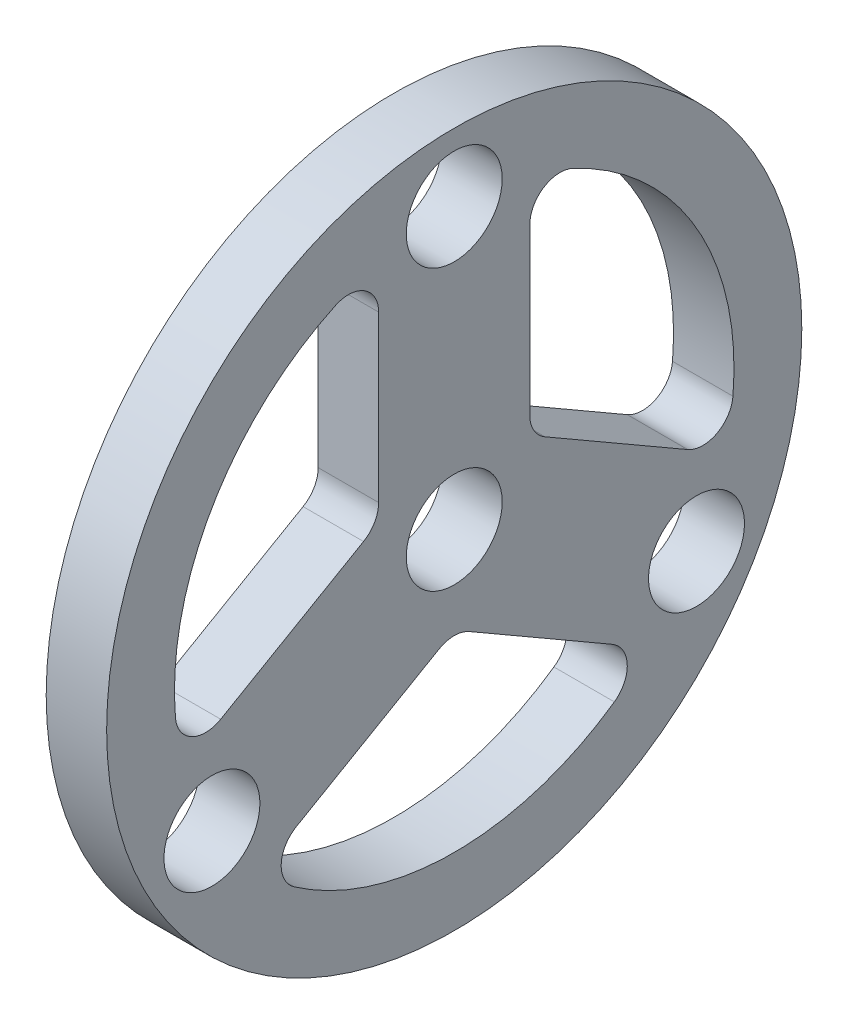
ISO-10303-21;
HEADER;
FILE_DESCRIPTION(('STEP AP214'),'2;1');
FILE_NAME('part.step','',(''),(''),'','','');
FILE_SCHEMA(('AUTOMOTIVE_DESIGN { 1 0 10303 214 1 1 1 1 }'));
ENDSEC;
DATA;
#1=APPLICATION_CONTEXT('core data for automotive mechanical design processes');
#2=APPLICATION_PROTOCOL_DEFINITION('international standard','automotive_design',2000,#1);
#3=PRODUCT_CONTEXT('',#1,'mechanical');
#4=PRODUCT('Part','Part','',(#3));
#5=PRODUCT_RELATED_PRODUCT_CATEGORY('part','',(#4));
#6=PRODUCT_DEFINITION_FORMATION('','',#4);
#7=PRODUCT_DEFINITION_CONTEXT('part definition',#1,'design');
#8=PRODUCT_DEFINITION('design','',#6,#7);
#9=PRODUCT_DEFINITION_SHAPE('','',#8);
#10=(LENGTH_UNIT() NAMED_UNIT(*) SI_UNIT(.MILLI.,.METRE.));
#11=(NAMED_UNIT(*) PLANE_ANGLE_UNIT() SI_UNIT($,.RADIAN.));
#12=(NAMED_UNIT(*) SI_UNIT($,.STERADIAN.) SOLID_ANGLE_UNIT());
#13=UNCERTAINTY_MEASURE_WITH_UNIT(LENGTH_MEASURE(1.E-05),#10,'distance_accuracy_value','');
#14=(GEOMETRIC_REPRESENTATION_CONTEXT(3) GLOBAL_UNCERTAINTY_ASSIGNED_CONTEXT((#13)) GLOBAL_UNIT_ASSIGNED_CONTEXT((#10,
#11,#12)) REPRESENTATION_CONTEXT('',''));
#15=CARTESIAN_POINT('',(0.,0.,0.));
#16=DIRECTION('',(0.,0.,1.));
#17=DIRECTION('',(1.,0.,0.));
#18=AXIS2_PLACEMENT_3D('',#15,#16,#17);
#19=CARTESIAN_POINT('',(4.,0.,0.));
#20=DIRECTION('',(1.,0.,0.));
#21=DIRECTION('',(0.,0.,-1.));
#22=AXIS2_PLACEMENT_3D('',#19,#20,#21);
#23=PLANE('',#22);
#24=DIRECTION('',(0.,1.,0.));
#25=VECTOR('',#24,1.);
#26=CARTESIAN_POINT('',(4.,4.04145188432742,5.00000000000001));
#27=LINE('',#26,#25);
#28=CARTESIAN_POINT('',(4.,4.04145188432742,5.00000000000001));
#29=VERTEX_POINT('',#28);
#30=CARTESIAN_POINT('',(4.,14.9553554371001,5.00000000000001));
#31=VERTEX_POINT('',#30);
#32=EDGE_CURVE('E211',#29,#31,#27,.T.);
#33=ORIENTED_EDGE('',*,*,#32,.F.);
#34=CARTESIAN_POINT('',(4.,4.04145188432741,7.00000000000001));
#35=DIRECTION('',(1.,0.,0.));
#36=DIRECTION('',(0.,0.,-1.));
#37=AXIS2_PLACEMENT_3D('',#34,#35,#36);
#38=CIRCLE('',#37,2.);
#39=CARTESIAN_POINT('',(4.,2.30940107675852,6.00000000000003));
#40=VERTEX_POINT('',#39);
#41=EDGE_CURVE('E209',#40,#29,#38,.T.);
#42=ORIENTED_EDGE('',*,*,#41,.F.);
#43=DIRECTION('',(0.,0.499999999999992,-0.866025403784443));
#44=VECTOR('',#43,1.);
#45=CARTESIAN_POINT('',(4.,2.30940107675852,6.00000000000003));
#46=LINE('',#45,#44);
#47=CARTESIAN_POINT('',(4.,-3.14755069962773,15.4517177311545));
#48=VERTEX_POINT('',#47);
#49=EDGE_CURVE('E221',#48,#40,#46,.T.);
#50=ORIENTED_EDGE('',*,*,#49,.F.);
#51=CARTESIAN_POINT('',(4.,-1.41549989205884,16.4517177311544));
#52=DIRECTION('',(1.,0.,0.));
#53=DIRECTION('',(0.,0.,1.));
#54=AXIS2_PLACEMENT_3D('',#51,#52,#53);
#55=CIRCLE('',#54,2.);
#56=CARTESIAN_POINT('',(4.,-1.58694575332259,18.4443557606659));
#57=VERTEX_POINT('',#56);
#58=EDGE_CURVE('E218',#57,#48,#55,.T.);
#59=ORIENTED_EDGE('',*,*,#58,.F.);
#60=CARTESIAN_POINT('',(4.,0.,0.));
#61=DIRECTION('',(1.,0.,0.));
#62=DIRECTION('',(0.,0.,-1.));
#63=AXIS2_PLACEMENT_3D('',#60,#61,#62);
#64=CIRCLE('',#63,18.5125);
#65=CARTESIAN_POINT('',(4.,16.7667535218359,7.84784254352764));
#66=VERTEX_POINT('',#65);
#67=EDGE_CURVE('E216',#66,#57,#64,.T.);
#68=ORIENTED_EDGE('',*,*,#67,.F.);
#69=CARTESIAN_POINT('',(4.,14.9553554371001,7.00000000000001));
#70=DIRECTION('',(1.,0.,0.));
#71=DIRECTION('',(0.,0.,-1.));
#72=AXIS2_PLACEMENT_3D('',#69,#70,#71);
#73=CIRCLE('',#72,2.);
#74=EDGE_CURVE('E214',#31,#66,#73,.T.);
#75=ORIENTED_EDGE('',*,*,#74,.F.);
#76=EDGE_LOOP('',(#33,#42,#50,#59,#68,#75));
#77=FACE_BOUND('',#76,.T.);
#78=CARTESIAN_POINT('',(4.,-9.25624999999985,16.0322952875595));
#79=DIRECTION('',(1.,0.,0.));
#80=DIRECTION('',(0.,0.,-1.));
#81=AXIS2_PLACEMENT_3D('',#78,#79,#80);
#82=CIRCLE('',#81,3.175);
#83=CARTESIAN_POINT('',(4.,-9.25624999999985,12.8572952875595));
#84=VERTEX_POINT('',#83);
#85=EDGE_CURVE('E299',#84,#84,#82,.T.);
#86=ORIENTED_EDGE('',*,*,#85,.F.);
#87=EDGE_LOOP('',(#86));
#88=FACE_BOUND('',#87,.T.);
#89=CARTESIAN_POINT('',(4.,18.5125,0.));
#90=DIRECTION('',(1.,0.,0.));
#91=DIRECTION('',(0.,0.,-1.));
#92=AXIS2_PLACEMENT_3D('',#89,#90,#91);
#93=CIRCLE('',#92,3.175);
#94=CARTESIAN_POINT('',(4.,18.5125,-3.175));
#95=VERTEX_POINT('',#94);
#96=EDGE_CURVE('E311',#95,#95,#93,.T.);
#97=ORIENTED_EDGE('',*,*,#96,.F.);
#98=EDGE_LOOP('',(#97));
#99=FACE_BOUND('',#98,.T.);
#100=CARTESIAN_POINT('',(4.,0.,0.));
#101=DIRECTION('',(1.,0.,0.));
#102=DIRECTION('',(0.,0.,-1.));
#103=AXIS2_PLACEMENT_3D('',#100,#101,#102);
#104=CIRCLE('',#103,23.);
#105=CARTESIAN_POINT('',(4.,0.,-23.));
#106=VERTEX_POINT('',#105);
#107=EDGE_CURVE('E11',#106,#106,#104,.T.);
#108=ORIENTED_EDGE('',*,*,#107,.T.);
#109=EDGE_LOOP('',(#108));
#110=FACE_BOUND('',#109,.T.);
#111=CARTESIAN_POINT('',(4.,0.,0.));
#112=DIRECTION('',(1.,0.,0.));
#113=DIRECTION('',(0.,0.,-1.));
#114=AXIS2_PLACEMENT_3D('',#111,#112,#113);
#115=CIRCLE('',#114,3.175);
#116=CARTESIAN_POINT('',(4.,0.,-3.17499999999999));
#117=VERTEX_POINT('',#116);
#118=EDGE_CURVE('E317',#117,#117,#115,.T.);
#119=ORIENTED_EDGE('',*,*,#118,.F.);
#120=EDGE_LOOP('',(#119));
#121=FACE_BOUND('',#120,.T.);
#122=CARTESIAN_POINT('',(4.,-9.25625000000008,-16.0322952875594));
#123=DIRECTION('',(1.,0.,0.));
#124=DIRECTION('',(0.,0.,-1.));
#125=AXIS2_PLACEMENT_3D('',#122,#123,#124);
#126=CIRCLE('',#125,3.175);
#127=CARTESIAN_POINT('',(4.,-9.25625000000008,-19.2072952875594));
#128=VERTEX_POINT('',#127);
#129=EDGE_CURVE('E305',#128,#128,#126,.T.);
#130=ORIENTED_EDGE('',*,*,#129,.F.);
#131=EDGE_LOOP('',(#130));
#132=FACE_BOUND('',#131,.T.);
#133=DIRECTION('',(0.,-0.500000000000004,-0.866025403784436));
#134=VECTOR('',#133,1.);
#135=CARTESIAN_POINT('',(4.,2.30940107675846,-6.00000000000005));
#136=LINE('',#135,#134);
#137=CARTESIAN_POINT('',(4.,2.30940107675846,-6.00000000000005));
#138=VERTEX_POINT('',#137);
#139=CARTESIAN_POINT('',(4.,-3.14755069962793,-15.4517177311544));
#140=VERTEX_POINT('',#139);
#141=EDGE_CURVE('E256',#138,#140,#136,.T.);
#142=ORIENTED_EDGE('',*,*,#141,.F.);
#143=CARTESIAN_POINT('',(4.,4.04145188432734,-7.00000000000005));
#144=DIRECTION('',(1.,0.,0.));
#145=DIRECTION('',(0.,0.,-1.));
#146=AXIS2_PLACEMENT_3D('',#143,#144,#145);
#147=CIRCLE('',#146,2.);
#148=CARTESIAN_POINT('',(4.,4.04145188432738,-5.00000000000005));
#149=VERTEX_POINT('',#148);
#150=EDGE_CURVE('E254',#149,#138,#147,.T.);
#151=ORIENTED_EDGE('',*,*,#150,.F.);
#152=DIRECTION('',(0.,-1.,0.));
#153=VECTOR('',#152,1.);
#154=CARTESIAN_POINT('',(4.,4.04145188432738,-5.00000000000005));
#155=LINE('',#154,#153);
#156=CARTESIAN_POINT('',(4.,14.9553554371,-5.0000000000002));
#157=VERTEX_POINT('',#156);
#158=EDGE_CURVE('E266',#157,#149,#155,.T.);
#159=ORIENTED_EDGE('',*,*,#158,.F.);
#160=CARTESIAN_POINT('',(4.,14.9553554371,-7.0000000000002));
#161=DIRECTION('',(1.,0.,0.));
#162=DIRECTION('',(0.,0.,1.));
#163=AXIS2_PLACEMENT_3D('',#160,#161,#162);
#164=CIRCLE('',#163,2.);
#165=CARTESIAN_POINT('',(4.,16.7667535218358,-7.84784254352786));
#166=VERTEX_POINT('',#165);
#167=EDGE_CURVE('E263',#166,#157,#164,.T.);
#168=ORIENTED_EDGE('',*,*,#167,.F.);
#169=CARTESIAN_POINT('',(4.,0.,0.));
#170=DIRECTION('',(1.,0.,0.));
#171=DIRECTION('',(0.,0.,-1.));
#172=AXIS2_PLACEMENT_3D('',#169,#170,#171);
#173=CIRCLE('',#172,18.5125);
#174=CARTESIAN_POINT('',(4.,-1.58694575332283,-18.4443557606659));
#175=VERTEX_POINT('',#174);
#176=EDGE_CURVE('E261',#175,#166,#173,.T.);
#177=ORIENTED_EDGE('',*,*,#176,.F.);
#178=CARTESIAN_POINT('',(4.,-1.41549989205905,-16.4517177311544));
#179=DIRECTION('',(1.,0.,0.));
#180=DIRECTION('',(0.,0.,-1.));
#181=AXIS2_PLACEMENT_3D('',#178,#179,#180);
#182=CIRCLE('',#181,2.);
#183=EDGE_CURVE('E259',#140,#175,#182,.T.);
#184=ORIENTED_EDGE('',*,*,#183,.F.);
#185=EDGE_LOOP('',(#142,#151,#159,#168,#177,#184));
#186=FACE_BOUND('',#185,.T.);
#187=DIRECTION('',(0.,-0.499999999999992,0.866025403784443));
#188=VECTOR('',#187,1.);
#189=CARTESIAN_POINT('',(4.,-6.3508529610859,1.00000000000009));
#190=LINE('',#189,#188);
#191=CARTESIAN_POINT('',(4.,-6.3508529610859,1.00000000000009));
#192=VERTEX_POINT('',#191);
#193=CARTESIAN_POINT('',(4.,-11.8078047374722,10.4517177311545));
#194=VERTEX_POINT('',#193);
#195=EDGE_CURVE('E166',#192,#194,#190,.T.);
#196=ORIENTED_EDGE('',*,*,#195,.F.);
#197=CARTESIAN_POINT('',(4.,-8.08290376865478,1.00180280737661E-13));
#198=DIRECTION('',(1.,0.,0.));
#199=DIRECTION('',(0.,0.,-1.));
#200=AXIS2_PLACEMENT_3D('',#197,#198,#199);
#201=CIRCLE('',#200,2.);
#202=CARTESIAN_POINT('',(4.,-6.35085296108593,-0.99999999999994));
#203=VERTEX_POINT('',#202);
#204=EDGE_CURVE('E158',#203,#192,#201,.T.);
#205=ORIENTED_EDGE('',*,*,#204,.F.);
#206=DIRECTION('',(0.,0.499999999999975,0.866025403784453));
#207=VECTOR('',#206,1.);
#208=CARTESIAN_POINT('',(4.,-6.35085296108593,-0.99999999999994));
#209=LINE('',#208,#207);
#210=CARTESIAN_POINT('',(4.,-11.8078047374721,-10.4517177311546));
#211=VERTEX_POINT('',#210);
#212=EDGE_CURVE('E187',#211,#203,#209,.T.);
#213=ORIENTED_EDGE('',*,*,#212,.F.);
#214=CARTESIAN_POINT('',(4.,-13.539855545041,-9.45171773115464));
#215=DIRECTION('',(1.,0.,0.));
#216=DIRECTION('',(0.,0.,1.));
#217=AXIS2_PLACEMENT_3D('',#214,#215,#216);
#218=CIRCLE('',#217,2.);
#219=CARTESIAN_POINT('',(4.,-15.179807768513,-10.5965132171385));
#220=VERTEX_POINT('',#219);
#221=EDGE_CURVE('E185',#220,#211,#218,.T.);
#222=ORIENTED_EDGE('',*,*,#221,.F.);
#223=CARTESIAN_POINT('',(4.,0.,0.));
#224=DIRECTION('',(1.,0.,0.));
#225=DIRECTION('',(0.,0.,-1.));
#226=AXIS2_PLACEMENT_3D('',#223,#224,#225);
#227=CIRCLE('',#226,18.5125);
#228=CARTESIAN_POINT('',(4.,-15.1798077685131,10.5965132171384));
#229=VERTEX_POINT('',#228);
#230=EDGE_CURVE('E181',#229,#220,#227,.T.);
#231=ORIENTED_EDGE('',*,*,#230,.F.);
#232=CARTESIAN_POINT('',(4.,-13.539855545041,9.45171773115455));
#233=DIRECTION('',(1.,0.,0.));
#234=DIRECTION('',(0.,0.,-1.));
#235=AXIS2_PLACEMENT_3D('',#232,#233,#234);
#236=CIRCLE('',#235,2.);
#237=EDGE_CURVE('E179',#194,#229,#236,.T.);
#238=ORIENTED_EDGE('',*,*,#237,.F.);
#239=EDGE_LOOP('',(#196,#205,#213,#222,#231,#238));
#240=FACE_BOUND('',#239,.T.);
#241=ADVANCED_FACE('F33',(#77,#88,#99,#110,#121,#132,#186,#240),#23,.T.);
#242=CARTESIAN_POINT('',(0.,0.,0.));
#243=DIRECTION('',(1.,0.,0.));
#244=DIRECTION('',(0.,0.,-1.));
#245=AXIS2_PLACEMENT_3D('',#242,#243,#244);
#246=PLANE('',#245);
#247=CARTESIAN_POINT('',(0.,4.04145188432741,7.00000000000001));
#248=DIRECTION('',(1.,0.,0.));
#249=DIRECTION('',(0.,0.,-1.));
#250=AXIS2_PLACEMENT_3D('',#247,#248,#249);
#251=CIRCLE('',#250,2.);
#252=CARTESIAN_POINT('',(0.,2.30940107675852,6.00000000000003));
#253=VERTEX_POINT('',#252);
#254=CARTESIAN_POINT('',(0.,4.04145188432742,5.00000000000001));
#255=VERTEX_POINT('',#254);
#256=EDGE_CURVE('E174',#253,#255,#251,.T.);
#257=ORIENTED_EDGE('',*,*,#256,.T.);
#258=DIRECTION('',(0.,1.,0.));
#259=VECTOR('',#258,1.);
#260=CARTESIAN_POINT('',(0.,4.04145188432742,5.00000000000001));
#261=LINE('',#260,#259);
#262=CARTESIAN_POINT('',(0.,14.9553554371001,5.00000000000001));
#263=VERTEX_POINT('',#262);
#264=EDGE_CURVE('E226',#255,#263,#261,.T.);
#265=ORIENTED_EDGE('',*,*,#264,.T.);
#266=CARTESIAN_POINT('',(0.,14.9553554371001,7.00000000000001));
#267=DIRECTION('',(1.,0.,0.));
#268=DIRECTION('',(0.,0.,-1.));
#269=AXIS2_PLACEMENT_3D('',#266,#267,#268);
#270=CIRCLE('',#269,2.);
#271=CARTESIAN_POINT('',(0.,16.7667535218359,7.84784254352764));
#272=VERTEX_POINT('',#271);
#273=EDGE_CURVE('E229',#263,#272,#270,.T.);
#274=ORIENTED_EDGE('',*,*,#273,.T.);
#275=CARTESIAN_POINT('',(0.,0.,0.));
#276=DIRECTION('',(1.,0.,0.));
#277=DIRECTION('',(0.,0.,-1.));
#278=AXIS2_PLACEMENT_3D('',#275,#276,#277);
#279=CIRCLE('',#278,18.5125);
#280=CARTESIAN_POINT('',(0.,-1.58694575332259,18.4443557606659));
#281=VERTEX_POINT('',#280);
#282=EDGE_CURVE('E232',#272,#281,#279,.T.);
#283=ORIENTED_EDGE('',*,*,#282,.T.);
#284=CARTESIAN_POINT('',(0.,-1.41549989205884,16.4517177311544));
#285=DIRECTION('',(1.,0.,0.));
#286=DIRECTION('',(0.,0.,1.));
#287=AXIS2_PLACEMENT_3D('',#284,#285,#286);
#288=CIRCLE('',#287,2.);
#289=CARTESIAN_POINT('',(0.,-3.14755069962773,15.4517177311545));
#290=VERTEX_POINT('',#289);
#291=EDGE_CURVE('E235',#281,#290,#288,.T.);
#292=ORIENTED_EDGE('',*,*,#291,.T.);
#293=DIRECTION('',(0.,0.499999999999992,-0.866025403784443));
#294=VECTOR('',#293,1.);
#295=CARTESIAN_POINT('',(0.,2.30940107675852,6.00000000000003));
#296=LINE('',#295,#294);
#297=EDGE_CURVE('E212',#290,#253,#296,.T.);
#298=ORIENTED_EDGE('',*,*,#297,.T.);
#299=EDGE_LOOP('',(#257,#265,#274,#283,#292,#298));
#300=FACE_BOUND('',#299,.T.);
#301=CARTESIAN_POINT('',(0.,-9.25624999999985,16.0322952875595));
#302=DIRECTION('',(1.,0.,0.));
#303=DIRECTION('',(0.,0.,-1.));
#304=AXIS2_PLACEMENT_3D('',#301,#302,#303);
#305=CIRCLE('',#304,3.175);
#306=CARTESIAN_POINT('',(0.,-9.25624999999985,12.8572952875595));
#307=VERTEX_POINT('',#306);
#308=EDGE_CURVE('E298',#307,#307,#305,.T.);
#309=ORIENTED_EDGE('',*,*,#308,.T.);
#310=EDGE_LOOP('',(#309));
#311=FACE_BOUND('',#310,.T.);
#312=CARTESIAN_POINT('',(0.,18.5125,0.));
#313=DIRECTION('',(1.,0.,0.));
#314=DIRECTION('',(0.,0.,-1.));
#315=AXIS2_PLACEMENT_3D('',#312,#313,#314);
#316=CIRCLE('',#315,3.175);
#317=CARTESIAN_POINT('',(0.,18.5125,-3.175));
#318=VERTEX_POINT('',#317);
#319=EDGE_CURVE('E308',#318,#318,#316,.T.);
#320=ORIENTED_EDGE('',*,*,#319,.T.);
#321=EDGE_LOOP('',(#320));
#322=FACE_BOUND('',#321,.T.);
#323=CARTESIAN_POINT('',(0.,0.,0.));
#324=DIRECTION('',(1.,0.,0.));
#325=DIRECTION('',(0.,0.,-1.));
#326=AXIS2_PLACEMENT_3D('',#323,#324,#325);
#327=CIRCLE('',#326,23.);
#328=CARTESIAN_POINT('',(0.,0.,-23.));
#329=VERTEX_POINT('',#328);
#330=EDGE_CURVE('E37',#329,#329,#327,.T.);
#331=ORIENTED_EDGE('',*,*,#330,.F.);
#332=EDGE_LOOP('',(#331));
#333=FACE_BOUND('',#332,.T.);
#334=CARTESIAN_POINT('',(0.,0.,0.));
#335=DIRECTION('',(1.,0.,0.));
#336=DIRECTION('',(0.,0.,-1.));
#337=AXIS2_PLACEMENT_3D('',#334,#335,#336);
#338=CIRCLE('',#337,3.175);
#339=CARTESIAN_POINT('',(0.,0.,-3.17499999999999));
#340=VERTEX_POINT('',#339);
#341=EDGE_CURVE('E314',#340,#340,#338,.T.);
#342=ORIENTED_EDGE('',*,*,#341,.T.);
#343=EDGE_LOOP('',(#342));
#344=FACE_BOUND('',#343,.T.);
#345=CARTESIAN_POINT('',(0.,-9.25625000000008,-16.0322952875594));
#346=DIRECTION('',(1.,0.,0.));
#347=DIRECTION('',(0.,0.,-1.));
#348=AXIS2_PLACEMENT_3D('',#345,#346,#347);
#349=CIRCLE('',#348,3.175);
#350=CARTESIAN_POINT('',(0.,-9.25625000000008,-19.2072952875594));
#351=VERTEX_POINT('',#350);
#352=EDGE_CURVE('E302',#351,#351,#349,.T.);
#353=ORIENTED_EDGE('',*,*,#352,.T.);
#354=EDGE_LOOP('',(#353));
#355=FACE_BOUND('',#354,.T.);
#356=CARTESIAN_POINT('',(0.,4.04145188432734,-7.00000000000005));
#357=DIRECTION('',(1.,0.,0.));
#358=DIRECTION('',(0.,0.,-1.));
#359=AXIS2_PLACEMENT_3D('',#356,#357,#358);
#360=CIRCLE('',#359,2.);
#361=CARTESIAN_POINT('',(0.,4.04145188432738,-5.00000000000005));
#362=VERTEX_POINT('',#361);
#363=CARTESIAN_POINT('',(0.,2.30940107675846,-6.00000000000005));
#364=VERTEX_POINT('',#363);
#365=EDGE_CURVE('E253',#362,#364,#360,.T.);
#366=ORIENTED_EDGE('',*,*,#365,.T.);
#367=DIRECTION('',(0.,-0.500000000000004,-0.866025403784436));
#368=VECTOR('',#367,1.);
#369=CARTESIAN_POINT('',(0.,2.30940107675846,-6.00000000000005));
#370=LINE('',#369,#368);
#371=CARTESIAN_POINT('',(0.,-3.14755069962793,-15.4517177311544));
#372=VERTEX_POINT('',#371);
#373=EDGE_CURVE('E271',#364,#372,#370,.T.);
#374=ORIENTED_EDGE('',*,*,#373,.T.);
#375=CARTESIAN_POINT('',(0.,-1.41549989205905,-16.4517177311544));
#376=DIRECTION('',(1.,0.,0.));
#377=DIRECTION('',(0.,0.,-1.));
#378=AXIS2_PLACEMENT_3D('',#375,#376,#377);
#379=CIRCLE('',#378,2.);
#380=CARTESIAN_POINT('',(0.,-1.58694575332283,-18.4443557606659));
#381=VERTEX_POINT('',#380);
#382=EDGE_CURVE('E274',#372,#381,#379,.T.);
#383=ORIENTED_EDGE('',*,*,#382,.T.);
#384=CARTESIAN_POINT('',(0.,0.,0.));
#385=DIRECTION('',(1.,0.,0.));
#386=DIRECTION('',(0.,0.,-1.));
#387=AXIS2_PLACEMENT_3D('',#384,#385,#386);
#388=CIRCLE('',#387,18.5125);
#389=CARTESIAN_POINT('',(0.,16.7667535218358,-7.84784254352786));
#390=VERTEX_POINT('',#389);
#391=EDGE_CURVE('E277',#381,#390,#388,.T.);
#392=ORIENTED_EDGE('',*,*,#391,.T.);
#393=CARTESIAN_POINT('',(0.,14.9553554371,-7.0000000000002));
#394=DIRECTION('',(1.,0.,0.));
#395=DIRECTION('',(0.,0.,1.));
#396=AXIS2_PLACEMENT_3D('',#393,#394,#395);
#397=CIRCLE('',#396,2.);
#398=CARTESIAN_POINT('',(0.,14.9553554371,-5.0000000000002));
#399=VERTEX_POINT('',#398);
#400=EDGE_CURVE('E280',#390,#399,#397,.T.);
#401=ORIENTED_EDGE('',*,*,#400,.T.);
#402=DIRECTION('',(0.,-1.,0.));
#403=VECTOR('',#402,1.);
#404=CARTESIAN_POINT('',(0.,4.04145188432738,-5.00000000000005));
#405=LINE('',#404,#403);
#406=EDGE_CURVE('E257',#399,#362,#405,.T.);
#407=ORIENTED_EDGE('',*,*,#406,.T.);
#408=EDGE_LOOP('',(#366,#374,#383,#392,#401,#407));
#409=FACE_BOUND('',#408,.T.);
#410=CARTESIAN_POINT('',(0.,-8.08290376865478,1.00180280737661E-13));
#411=DIRECTION('',(1.,0.,0.));
#412=DIRECTION('',(0.,0.,-1.));
#413=AXIS2_PLACEMENT_3D('',#410,#411,#412);
#414=CIRCLE('',#413,2.);
#415=CARTESIAN_POINT('',(0.,-6.35085296108593,-0.99999999999994));
#416=VERTEX_POINT('',#415);
#417=CARTESIAN_POINT('',(0.,-6.3508529610859,1.00000000000009));
#418=VERTEX_POINT('',#417);
#419=EDGE_CURVE('E56',#416,#418,#414,.T.);
#420=ORIENTED_EDGE('',*,*,#419,.T.);
#421=DIRECTION('',(0.,-0.499999999999992,0.866025403784443));
#422=VECTOR('',#421,1.);
#423=CARTESIAN_POINT('',(0.,-6.3508529610859,1.00000000000009));
#424=LINE('',#423,#422);
#425=CARTESIAN_POINT('',(0.,-11.8078047374722,10.4517177311545));
#426=VERTEX_POINT('',#425);
#427=EDGE_CURVE('E173',#418,#426,#424,.T.);
#428=ORIENTED_EDGE('',*,*,#427,.T.);
#429=CARTESIAN_POINT('',(0.,-13.539855545041,9.45171773115455));
#430=DIRECTION('',(1.,0.,0.));
#431=DIRECTION('',(0.,0.,-1.));
#432=AXIS2_PLACEMENT_3D('',#429,#430,#431);
#433=CIRCLE('',#432,2.);
#434=CARTESIAN_POINT('',(0.,-15.1798077685131,10.5965132171384));
#435=VERTEX_POINT('',#434);
#436=EDGE_CURVE('E191',#426,#435,#433,.T.);
#437=ORIENTED_EDGE('',*,*,#436,.T.);
#438=CARTESIAN_POINT('',(0.,0.,0.));
#439=DIRECTION('',(1.,0.,0.));
#440=DIRECTION('',(0.,0.,-1.));
#441=AXIS2_PLACEMENT_3D('',#438,#439,#440);
#442=CIRCLE('',#441,18.5125);
#443=CARTESIAN_POINT('',(0.,-15.179807768513,-10.5965132171385));
#444=VERTEX_POINT('',#443);
#445=EDGE_CURVE('E194',#435,#444,#442,.T.);
#446=ORIENTED_EDGE('',*,*,#445,.T.);
#447=CARTESIAN_POINT('',(0.,-13.539855545041,-9.45171773115464));
#448=DIRECTION('',(1.,0.,0.));
#449=DIRECTION('',(0.,0.,1.));
#450=AXIS2_PLACEMENT_3D('',#447,#448,#449);
#451=CIRCLE('',#450,2.);
#452=CARTESIAN_POINT('',(0.,-11.8078047374721,-10.4517177311546));
#453=VERTEX_POINT('',#452);
#454=EDGE_CURVE('E197',#444,#453,#451,.T.);
#455=ORIENTED_EDGE('',*,*,#454,.T.);
#456=DIRECTION('',(0.,0.499999999999975,0.866025403784453));
#457=VECTOR('',#456,1.);
#458=CARTESIAN_POINT('',(0.,-6.35085296108593,-0.99999999999994));
#459=LINE('',#458,#457);
#460=EDGE_CURVE('E167',#453,#416,#459,.T.);
#461=ORIENTED_EDGE('',*,*,#460,.T.);
#462=EDGE_LOOP('',(#420,#428,#437,#446,#455,#461));
#463=FACE_BOUND('',#462,.T.);
#464=ADVANCED_FACE('F323',(#300,#311,#322,#333,#344,#355,#409,#463),#246,.F.);
#465=CARTESIAN_POINT('',(4.,0.,0.));
#466=DIRECTION('',(-1.,0.,0.));
#467=DIRECTION('',(0.,0.,1.));
#468=AXIS2_PLACEMENT_3D('',#465,#466,#467);
#469=CYLINDRICAL_SURFACE('',#468,23.);
#470=ORIENTED_EDGE('',*,*,#107,.F.);
#471=EDGE_LOOP('',(#470));
#472=FACE_BOUND('',#471,.T.);
#473=ORIENTED_EDGE('',*,*,#330,.T.);
#474=EDGE_LOOP('',(#473));
#475=FACE_BOUND('',#474,.T.);
#476=ADVANCED_FACE('F35',(#472,#475),#469,.T.);
#477=CARTESIAN_POINT('',(4.,0.,0.));
#478=DIRECTION('',(-1.,0.,0.));
#479=DIRECTION('',(0.,0.,1.));
#480=AXIS2_PLACEMENT_3D('',#477,#478,#479);
#481=CYLINDRICAL_SURFACE('',#480,3.175);
#482=ORIENTED_EDGE('',*,*,#118,.T.);
#483=EDGE_LOOP('',(#482));
#484=FACE_BOUND('',#483,.T.);
#485=ORIENTED_EDGE('',*,*,#341,.F.);
#486=EDGE_LOOP('',(#485));
#487=FACE_BOUND('',#486,.T.);
#488=ADVANCED_FACE('F326',(#484,#487),#481,.F.);
#489=CARTESIAN_POINT('',(4.,18.5125,0.));
#490=DIRECTION('',(-1.,0.,0.));
#491=DIRECTION('',(0.,0.,1.));
#492=AXIS2_PLACEMENT_3D('',#489,#490,#491);
#493=CYLINDRICAL_SURFACE('',#492,3.175);
#494=ORIENTED_EDGE('',*,*,#96,.T.);
#495=EDGE_LOOP('',(#494));
#496=FACE_BOUND('',#495,.T.);
#497=ORIENTED_EDGE('',*,*,#319,.F.);
#498=EDGE_LOOP('',(#497));
#499=FACE_BOUND('',#498,.T.);
#500=ADVANCED_FACE('F328',(#496,#499),#493,.F.);
#501=CARTESIAN_POINT('',(4.,-9.25625000000008,-16.0322952875594));
#502=DIRECTION('',(-1.,0.,0.));
#503=DIRECTION('',(0.,0.,1.));
#504=AXIS2_PLACEMENT_3D('',#501,#502,#503);
#505=CYLINDRICAL_SURFACE('',#504,3.175);
#506=ORIENTED_EDGE('',*,*,#129,.T.);
#507=EDGE_LOOP('',(#506));
#508=FACE_BOUND('',#507,.T.);
#509=ORIENTED_EDGE('',*,*,#352,.F.);
#510=EDGE_LOOP('',(#509));
#511=FACE_BOUND('',#510,.T.);
#512=ADVANCED_FACE('F335',(#508,#511),#505,.F.);
#513=CARTESIAN_POINT('',(4.,-9.25624999999985,16.0322952875595));
#514=DIRECTION('',(-1.,0.,0.));
#515=DIRECTION('',(0.,0.,1.));
#516=AXIS2_PLACEMENT_3D('',#513,#514,#515);
#517=CYLINDRICAL_SURFACE('',#516,3.175);
#518=ORIENTED_EDGE('',*,*,#85,.T.);
#519=EDGE_LOOP('',(#518));
#520=FACE_BOUND('',#519,.T.);
#521=ORIENTED_EDGE('',*,*,#308,.F.);
#522=EDGE_LOOP('',(#521));
#523=FACE_BOUND('',#522,.T.);
#524=ADVANCED_FACE('F403',(#520,#523),#517,.F.);
#525=CARTESIAN_POINT('',(4.,4.04145188432734,-7.00000000000005));
#526=DIRECTION('',(-1.,0.,0.));
#527=DIRECTION('',(0.,0.,1.));
#528=AXIS2_PLACEMENT_3D('',#525,#526,#527);
#529=CYLINDRICAL_SURFACE('',#528,2.);
#530=ORIENTED_EDGE('',*,*,#365,.F.);
#531=DIRECTION('',(-1.,0.,0.));
#532=VECTOR('',#531,1.);
#533=CARTESIAN_POINT('',(4.,4.04145188432738,-5.00000000000005));
#534=LINE('',#533,#532);
#535=EDGE_CURVE('E268',#149,#362,#534,.T.);
#536=ORIENTED_EDGE('',*,*,#535,.F.);
#537=ORIENTED_EDGE('',*,*,#150,.T.);
#538=DIRECTION('',(-1.,0.,0.));
#539=VECTOR('',#538,1.);
#540=CARTESIAN_POINT('',(4.,2.30940107675846,-6.00000000000005));
#541=LINE('',#540,#539);
#542=EDGE_CURVE('E295',#138,#364,#541,.T.);
#543=ORIENTED_EDGE('',*,*,#542,.T.);
#544=EDGE_LOOP('',(#530,#536,#537,#543));
#545=FACE_BOUND('',#544,.T.);
#546=ADVANCED_FACE('F377',(#545),#529,.F.);
#547=CARTESIAN_POINT('',(4.,2.30940107675846,-6.00000000000005));
#548=DIRECTION('',(0.,0.866025403784436,-0.500000000000004));
#549=DIRECTION('',(0.,0.500000000000004,0.866025403784436));
#550=AXIS2_PLACEMENT_3D('',#547,#548,#549);
#551=PLANE('',#550);
#552=ORIENTED_EDGE('',*,*,#373,.F.);
#553=ORIENTED_EDGE('',*,*,#542,.F.);
#554=ORIENTED_EDGE('',*,*,#141,.T.);
#555=DIRECTION('',(-1.,0.,0.));
#556=VECTOR('',#555,1.);
#557=CARTESIAN_POINT('',(4.,-3.14755069962793,-15.4517177311544));
#558=LINE('',#557,#556);
#559=EDGE_CURVE('E293',#140,#372,#558,.T.);
#560=ORIENTED_EDGE('',*,*,#559,.T.);
#561=EDGE_LOOP('',(#552,#553,#554,#560));
#562=FACE_BOUND('',#561,.T.);
#563=ADVANCED_FACE('F368',(#562),#551,.T.);
#564=CARTESIAN_POINT('',(4.,-1.41549989205905,-16.4517177311544));
#565=DIRECTION('',(-1.,0.,0.));
#566=DIRECTION('',(0.,0.,1.));
#567=AXIS2_PLACEMENT_3D('',#564,#565,#566);
#568=CYLINDRICAL_SURFACE('',#567,2.);
#569=ORIENTED_EDGE('',*,*,#382,.F.);
#570=ORIENTED_EDGE('',*,*,#559,.F.);
#571=ORIENTED_EDGE('',*,*,#183,.T.);
#572=DIRECTION('',(-1.,0.,0.));
#573=VECTOR('',#572,1.);
#574=CARTESIAN_POINT('',(4.,-1.58694575332283,-18.4443557606659));
#575=LINE('',#574,#573);
#576=EDGE_CURVE('E291',#175,#381,#575,.T.);
#577=ORIENTED_EDGE('',*,*,#576,.T.);
#578=EDGE_LOOP('',(#569,#570,#571,#577));
#579=FACE_BOUND('',#578,.T.);
#580=ADVANCED_FACE('F371',(#579),#568,.F.);
#581=CARTESIAN_POINT('',(4.,0.,0.));
#582=DIRECTION('',(-1.,0.,0.));
#583=DIRECTION('',(0.,0.,1.));
#584=AXIS2_PLACEMENT_3D('',#581,#582,#583);
#585=CYLINDRICAL_SURFACE('',#584,18.5125);
#586=ORIENTED_EDGE('',*,*,#391,.F.);
#587=ORIENTED_EDGE('',*,*,#576,.F.);
#588=ORIENTED_EDGE('',*,*,#176,.T.);
#589=DIRECTION('',(-1.,0.,0.));
#590=VECTOR('',#589,1.);
#591=CARTESIAN_POINT('',(4.,16.7667535218358,-7.84784254352786));
#592=LINE('',#591,#590);
#593=EDGE_CURVE('E289',#166,#390,#592,.T.);
#594=ORIENTED_EDGE('',*,*,#593,.T.);
#595=EDGE_LOOP('',(#586,#587,#588,#594));
#596=FACE_BOUND('',#595,.T.);
#597=ADVANCED_FACE('F388',(#596),#585,.F.);
#598=CARTESIAN_POINT('',(4.,14.9553554371,-7.0000000000002));
#599=DIRECTION('',(-1.,0.,0.));
#600=DIRECTION('',(0.,0.,1.));
#601=AXIS2_PLACEMENT_3D('',#598,#599,#600);
#602=CYLINDRICAL_SURFACE('',#601,2.);
#603=ORIENTED_EDGE('',*,*,#400,.F.);
#604=ORIENTED_EDGE('',*,*,#593,.F.);
#605=ORIENTED_EDGE('',*,*,#167,.T.);
#606=DIRECTION('',(-1.,0.,0.));
#607=VECTOR('',#606,1.);
#608=CARTESIAN_POINT('',(4.,14.9553554371,-5.0000000000002));
#609=LINE('',#608,#607);
#610=EDGE_CURVE('E287',#157,#399,#609,.T.);
#611=ORIENTED_EDGE('',*,*,#610,.T.);
#612=EDGE_LOOP('',(#603,#604,#605,#611));
#613=FACE_BOUND('',#612,.T.);
#614=ADVANCED_FACE('F385',(#613),#602,.F.);
#615=CARTESIAN_POINT('',(4.,4.04145188432738,-5.00000000000005));
#616=DIRECTION('',(0.,0.,-1.));
#617=DIRECTION('',(0.,1.,0.));
#618=AXIS2_PLACEMENT_3D('',#615,#616,#617);
#619=PLANE('',#618);
#620=ORIENTED_EDGE('',*,*,#406,.F.);
#621=ORIENTED_EDGE('',*,*,#610,.F.);
#622=ORIENTED_EDGE('',*,*,#158,.T.);
#623=ORIENTED_EDGE('',*,*,#535,.T.);
#624=EDGE_LOOP('',(#620,#621,#622,#623));
#625=FACE_BOUND('',#624,.T.);
#626=ADVANCED_FACE('F381',(#625),#619,.T.);
#627=CARTESIAN_POINT('',(4.,4.04145188432741,7.00000000000001));
#628=DIRECTION('',(-1.,0.,0.));
#629=DIRECTION('',(0.,0.,1.));
#630=AXIS2_PLACEMENT_3D('',#627,#628,#629);
#631=CYLINDRICAL_SURFACE('',#630,2.);
#632=ORIENTED_EDGE('',*,*,#256,.F.);
#633=DIRECTION('',(-1.,0.,0.));
#634=VECTOR('',#633,1.);
#635=CARTESIAN_POINT('',(4.,2.30940107675852,6.00000000000003));
#636=LINE('',#635,#634);
#637=EDGE_CURVE('E223',#40,#253,#636,.T.);
#638=ORIENTED_EDGE('',*,*,#637,.F.);
#639=ORIENTED_EDGE('',*,*,#41,.T.);
#640=DIRECTION('',(-1.,0.,0.));
#641=VECTOR('',#640,1.);
#642=CARTESIAN_POINT('',(4.,4.04145188432742,5.00000000000001));
#643=LINE('',#642,#641);
#644=EDGE_CURVE('E250',#29,#255,#643,.T.);
#645=ORIENTED_EDGE('',*,*,#644,.T.);
#646=EDGE_LOOP('',(#632,#638,#639,#645));
#647=FACE_BOUND('',#646,.T.);
#648=ADVANCED_FACE('F450',(#647),#631,.F.);
#649=CARTESIAN_POINT('',(4.,4.04145188432742,5.00000000000001));
#650=DIRECTION('',(0.,0.,1.));
#651=DIRECTION('',(0.,-1.,0.));
#652=AXIS2_PLACEMENT_3D('',#649,#650,#651);
#653=PLANE('',#652);
#654=ORIENTED_EDGE('',*,*,#264,.F.);
#655=ORIENTED_EDGE('',*,*,#644,.F.);
#656=ORIENTED_EDGE('',*,*,#32,.T.);
#657=DIRECTION('',(-1.,0.,0.));
#658=VECTOR('',#657,1.);
#659=CARTESIAN_POINT('',(4.,14.9553554371001,5.00000000000001));
#660=LINE('',#659,#658);
#661=EDGE_CURVE('E248',#31,#263,#660,.T.);
#662=ORIENTED_EDGE('',*,*,#661,.T.);
#663=EDGE_LOOP('',(#654,#655,#656,#662));
#664=FACE_BOUND('',#663,.T.);
#665=ADVANCED_FACE('F458',(#664),#653,.T.);
#666=CARTESIAN_POINT('',(4.,14.9553554371001,7.00000000000001));
#667=DIRECTION('',(-1.,0.,0.));
#668=DIRECTION('',(0.,0.,1.));
#669=AXIS2_PLACEMENT_3D('',#666,#667,#668);
#670=CYLINDRICAL_SURFACE('',#669,2.);
#671=ORIENTED_EDGE('',*,*,#273,.F.);
#672=ORIENTED_EDGE('',*,*,#661,.F.);
#673=ORIENTED_EDGE('',*,*,#74,.T.);
#674=DIRECTION('',(-1.,0.,0.));
#675=VECTOR('',#674,1.);
#676=CARTESIAN_POINT('',(4.,16.7667535218359,7.84784254352764));
#677=LINE('',#676,#675);
#678=EDGE_CURVE('E246',#66,#272,#677,.T.);
#679=ORIENTED_EDGE('',*,*,#678,.T.);
#680=EDGE_LOOP('',(#671,#672,#673,#679));
#681=FACE_BOUND('',#680,.T.);
#682=ADVANCED_FACE('F468',(#681),#670,.F.);
#683=CARTESIAN_POINT('',(4.,0.,0.));
#684=DIRECTION('',(-1.,0.,0.));
#685=DIRECTION('',(0.,0.,1.));
#686=AXIS2_PLACEMENT_3D('',#683,#684,#685);
#687=CYLINDRICAL_SURFACE('',#686,18.5125);
#688=ORIENTED_EDGE('',*,*,#282,.F.);
#689=ORIENTED_EDGE('',*,*,#678,.F.);
#690=ORIENTED_EDGE('',*,*,#67,.T.);
#691=DIRECTION('',(-1.,0.,0.));
#692=VECTOR('',#691,1.);
#693=CARTESIAN_POINT('',(4.,-1.58694575332259,18.4443557606659));
#694=LINE('',#693,#692);
#695=EDGE_CURVE('E244',#57,#281,#694,.T.);
#696=ORIENTED_EDGE('',*,*,#695,.T.);
#697=EDGE_LOOP('',(#688,#689,#690,#696));
#698=FACE_BOUND('',#697,.T.);
#699=ADVANCED_FACE('F478',(#698),#687,.F.);
#700=CARTESIAN_POINT('',(4.,-1.41549989205884,16.4517177311544));
#701=DIRECTION('',(-1.,0.,0.));
#702=DIRECTION('',(0.,0.,1.));
#703=AXIS2_PLACEMENT_3D('',#700,#701,#702);
#704=CYLINDRICAL_SURFACE('',#703,2.);
#705=ORIENTED_EDGE('',*,*,#291,.F.);
#706=ORIENTED_EDGE('',*,*,#695,.F.);
#707=ORIENTED_EDGE('',*,*,#58,.T.);
#708=DIRECTION('',(-1.,0.,0.));
#709=VECTOR('',#708,1.);
#710=CARTESIAN_POINT('',(4.,-3.14755069962773,15.4517177311545));
#711=LINE('',#710,#709);
#712=EDGE_CURVE('E242',#48,#290,#711,.T.);
#713=ORIENTED_EDGE('',*,*,#712,.T.);
#714=EDGE_LOOP('',(#705,#706,#707,#713));
#715=FACE_BOUND('',#714,.T.);
#716=ADVANCED_FACE('F488',(#715),#704,.F.);
#717=CARTESIAN_POINT('',(4.,2.30940107675852,6.00000000000003));
#718=DIRECTION('',(0.,0.866025403784443,0.499999999999992));
#719=DIRECTION('',(0.,-0.499999999999992,0.866025403784443));
#720=AXIS2_PLACEMENT_3D('',#717,#718,#719);
#721=PLANE('',#720);
#722=ORIENTED_EDGE('',*,*,#297,.F.);
#723=ORIENTED_EDGE('',*,*,#712,.F.);
#724=ORIENTED_EDGE('',*,*,#49,.T.);
#725=ORIENTED_EDGE('',*,*,#637,.T.);
#726=EDGE_LOOP('',(#722,#723,#724,#725));
#727=FACE_BOUND('',#726,.T.);
#728=ADVANCED_FACE('F498',(#727),#721,.T.);
#729=CARTESIAN_POINT('',(4.,-8.08290376865478,1.00180280737661E-13));
#730=DIRECTION('',(-1.,0.,0.));
#731=DIRECTION('',(0.,0.,1.));
#732=AXIS2_PLACEMENT_3D('',#729,#730,#731);
#733=CYLINDRICAL_SURFACE('',#732,2.);
#734=ORIENTED_EDGE('',*,*,#419,.F.);
#735=DIRECTION('',(-1.,0.,0.));
#736=VECTOR('',#735,1.);
#737=CARTESIAN_POINT('',(4.,-6.35085296108593,-0.99999999999994));
#738=LINE('',#737,#736);
#739=EDGE_CURVE('E162',#203,#416,#738,.T.);
#740=ORIENTED_EDGE('',*,*,#739,.F.);
#741=ORIENTED_EDGE('',*,*,#204,.T.);
#742=DIRECTION('',(-1.,0.,0.));
#743=VECTOR('',#742,1.);
#744=CARTESIAN_POINT('',(4.,-6.3508529610859,1.00000000000009));
#745=LINE('',#744,#743);
#746=EDGE_CURVE('E161',#192,#418,#745,.T.);
#747=ORIENTED_EDGE('',*,*,#746,.T.);
#748=EDGE_LOOP('',(#734,#740,#741,#747));
#749=FACE_BOUND('',#748,.T.);
#750=ADVANCED_FACE('F160',(#749),#733,.F.);
#751=CARTESIAN_POINT('',(4.,-6.3508529610859,1.00000000000009));
#752=DIRECTION('',(0.,-0.866025403784443,-0.499999999999992));
#753=DIRECTION('',(0.,0.499999999999992,-0.866025403784443));
#754=AXIS2_PLACEMENT_3D('',#751,#752,#753);
#755=PLANE('',#754);
#756=ORIENTED_EDGE('',*,*,#427,.F.);
#757=ORIENTED_EDGE('',*,*,#746,.F.);
#758=ORIENTED_EDGE('',*,*,#195,.T.);
#759=DIRECTION('',(-1.,0.,0.));
#760=VECTOR('',#759,1.);
#761=CARTESIAN_POINT('',(4.,-11.8078047374722,10.4517177311545));
#762=LINE('',#761,#760);
#763=EDGE_CURVE('E175',#194,#426,#762,.T.);
#764=ORIENTED_EDGE('',*,*,#763,.T.);
#765=EDGE_LOOP('',(#756,#757,#758,#764));
#766=FACE_BOUND('',#765,.T.);
#767=ADVANCED_FACE('F170',(#766),#755,.T.);
#768=CARTESIAN_POINT('',(4.,-13.539855545041,9.45171773115455));
#769=DIRECTION('',(-1.,0.,0.));
#770=DIRECTION('',(0.,0.,1.));
#771=AXIS2_PLACEMENT_3D('',#768,#769,#770);
#772=CYLINDRICAL_SURFACE('',#771,2.);
#773=ORIENTED_EDGE('',*,*,#436,.F.);
#774=ORIENTED_EDGE('',*,*,#763,.F.);
#775=ORIENTED_EDGE('',*,*,#237,.T.);
#776=DIRECTION('',(-1.,0.,0.));
#777=VECTOR('',#776,1.);
#778=CARTESIAN_POINT('',(4.,-15.1798077685131,10.5965132171384));
#779=LINE('',#778,#777);
#780=EDGE_CURVE('E206',#229,#435,#779,.T.);
#781=ORIENTED_EDGE('',*,*,#780,.T.);
#782=EDGE_LOOP('',(#773,#774,#775,#781));
#783=FACE_BOUND('',#782,.T.);
#784=ADVANCED_FACE('F525',(#783),#772,.F.);
#785=CARTESIAN_POINT('',(4.,0.,0.));
#786=DIRECTION('',(-1.,0.,0.));
#787=DIRECTION('',(0.,0.,1.));
#788=AXIS2_PLACEMENT_3D('',#785,#786,#787);
#789=CYLINDRICAL_SURFACE('',#788,18.5125);
#790=ORIENTED_EDGE('',*,*,#445,.F.);
#791=ORIENTED_EDGE('',*,*,#780,.F.);
#792=ORIENTED_EDGE('',*,*,#230,.T.);
#793=DIRECTION('',(-1.,0.,0.));
#794=VECTOR('',#793,1.);
#795=CARTESIAN_POINT('',(4.,-15.179807768513,-10.5965132171385));
#796=LINE('',#795,#794);
#797=EDGE_CURVE('E204',#220,#444,#796,.T.);
#798=ORIENTED_EDGE('',*,*,#797,.T.);
#799=EDGE_LOOP('',(#790,#791,#792,#798));
#800=FACE_BOUND('',#799,.T.);
#801=ADVANCED_FACE('F534',(#800),#789,.F.);
#802=CARTESIAN_POINT('',(4.,-13.539855545041,-9.45171773115464));
#803=DIRECTION('',(-1.,0.,0.));
#804=DIRECTION('',(0.,0.,1.));
#805=AXIS2_PLACEMENT_3D('',#802,#803,#804);
#806=CYLINDRICAL_SURFACE('',#805,2.);
#807=ORIENTED_EDGE('',*,*,#454,.F.);
#808=ORIENTED_EDGE('',*,*,#797,.F.);
#809=ORIENTED_EDGE('',*,*,#221,.T.);
#810=DIRECTION('',(-1.,0.,0.));
#811=VECTOR('',#810,1.);
#812=CARTESIAN_POINT('',(4.,-11.8078047374721,-10.4517177311546));
#813=LINE('',#812,#811);
#814=EDGE_CURVE('E48',#211,#453,#813,.T.);
#815=ORIENTED_EDGE('',*,*,#814,.T.);
#816=EDGE_LOOP('',(#807,#808,#809,#815));
#817=FACE_BOUND('',#816,.T.);
#818=ADVANCED_FACE('F544',(#817),#806,.F.);
#819=CARTESIAN_POINT('',(4.,-6.35085296108593,-0.99999999999994));
#820=DIRECTION('',(0.,-0.866025403784453,0.499999999999975));
#821=DIRECTION('',(0.,-0.499999999999975,-0.866025403784453));
#822=AXIS2_PLACEMENT_3D('',#819,#820,#821);
#823=PLANE('',#822);
#824=ORIENTED_EDGE('',*,*,#460,.F.);
#825=ORIENTED_EDGE('',*,*,#814,.F.);
#826=ORIENTED_EDGE('',*,*,#212,.T.);
#827=ORIENTED_EDGE('',*,*,#739,.T.);
#828=EDGE_LOOP('',(#824,#825,#826,#827));
#829=FACE_BOUND('',#828,.T.);
#830=ADVANCED_FACE('F554',(#829),#823,.T.);
#831=CLOSED_SHELL('',(#241,#464,#476,#488,#500,#512,#524,#546,#563,#580,#597,#614,#626,#648,
#665,#682,#699,#716,#728,#750,#767,#784,#801,#818,#830));
#832=MANIFOLD_SOLID_BREP('B2',#831);
#833=ADVANCED_BREP_SHAPE_REPRESENTATION('',(#18,#832),#14);
#834=SHAPE_DEFINITION_REPRESENTATION(#9,#833);
ENDSEC;
END-ISO-10303-21;
